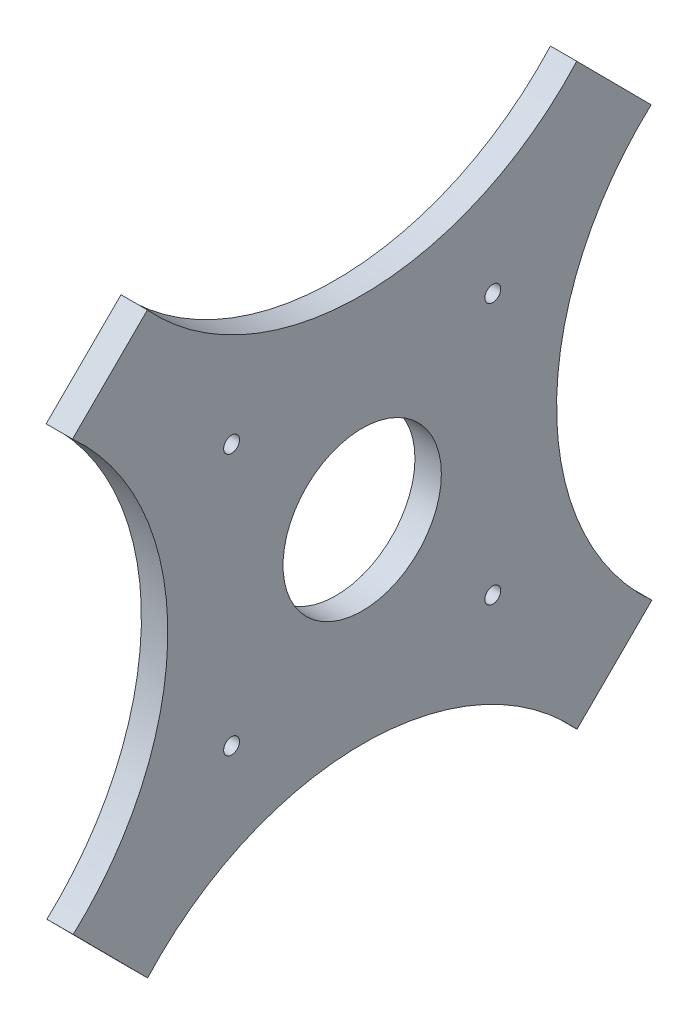
ISO-10303-21;
HEADER;
FILE_DESCRIPTION(('STEP AP214'),'2;1');
FILE_NAME('part.step','',(''),(''),'','','');
FILE_SCHEMA(('AUTOMOTIVE_DESIGN { 1 0 10303 214 1 1 1 1 }'));
ENDSEC;
DATA;
#1=APPLICATION_CONTEXT('core data for automotive mechanical design processes');
#2=APPLICATION_PROTOCOL_DEFINITION('international standard','automotive_design',2000,#1);
#3=PRODUCT_CONTEXT('',#1,'mechanical');
#4=PRODUCT('Part','Part','',(#3));
#5=PRODUCT_RELATED_PRODUCT_CATEGORY('part','',(#4));
#6=PRODUCT_DEFINITION_FORMATION('','',#4);
#7=PRODUCT_DEFINITION_CONTEXT('part definition',#1,'design');
#8=PRODUCT_DEFINITION('design','',#6,#7);
#9=PRODUCT_DEFINITION_SHAPE('','',#8);
#10=(LENGTH_UNIT() NAMED_UNIT(*) SI_UNIT(.MILLI.,.METRE.));
#11=(NAMED_UNIT(*) PLANE_ANGLE_UNIT() SI_UNIT($,.RADIAN.));
#12=(NAMED_UNIT(*) SI_UNIT($,.STERADIAN.) SOLID_ANGLE_UNIT());
#13=UNCERTAINTY_MEASURE_WITH_UNIT(LENGTH_MEASURE(1.E-05),#10,'distance_accuracy_value','');
#14=(GEOMETRIC_REPRESENTATION_CONTEXT(3) GLOBAL_UNCERTAINTY_ASSIGNED_CONTEXT((#13)) GLOBAL_UNIT_ASSIGNED_CONTEXT((#10,
#11,#12)) REPRESENTATION_CONTEXT('',''));
#15=CARTESIAN_POINT('',(0.,0.,0.));
#16=DIRECTION('',(0.,0.,1.));
#17=DIRECTION('',(1.,0.,0.));
#18=AXIS2_PLACEMENT_3D('',#15,#16,#17);
#19=CARTESIAN_POINT('',(5.,91.8371478475293,0.0795215444186728));
#20=DIRECTION('',(-1.,0.,0.));
#21=DIRECTION('',(0.,0.,1.));
#22=AXIS2_PLACEMENT_3D('',#19,#20,#21);
#23=PLANE('',#22);
#24=CARTESIAN_POINT('',(5.,91.8371478475293,0.0795215444186728));
#25=DIRECTION('',(-1.,0.,0.));
#26=DIRECTION('',(0.,0.,1.));
#27=AXIS2_PLACEMENT_3D('',#24,#25,#26);
#28=CIRCLE('',#27,55.0000000000001);
#29=CARTESIAN_POINT('',(5.,54.891168704609,-40.663510070459));
#30=VERTEX_POINT('',#29);
#31=CARTESIAN_POINT('',(5.,54.7561327206868,40.6996928533001));
#32=VERTEX_POINT('',#31);
#33=EDGE_CURVE('E150',#30,#32,#28,.T.);
#34=ORIENTED_EDGE('',*,*,#33,.T.);
#35=DIRECTION('',(0.,-0.704631132511389,0.709573792565451));
#36=VECTOR('',#35,1.);
#37=CARTESIAN_POINT('',(5.,40.6635100704589,54.8911687046093));
#38=LINE('',#37,#36);
#39=CARTESIAN_POINT('',(5.,40.6635100704589,54.8911687046093));
#40=VERTEX_POINT('',#39);
#41=EDGE_CURVE('E98',#32,#40,#38,.T.);
#42=ORIENTED_EDGE('',*,*,#41,.T.);
#43=CARTESIAN_POINT('',(5.,-0.0795215444186071,91.8371478475294));
#44=DIRECTION('',(-1.,0.,0.));
#45=DIRECTION('',(0.,0.,1.));
#46=AXIS2_PLACEMENT_3D('',#43,#44,#45);
#47=CIRCLE('',#46,55.);
#48=CARTESIAN_POINT('',(5.,-40.6996928533002,54.7561327206871));
#49=VERTEX_POINT('',#48);
#50=EDGE_CURVE('E165',#40,#49,#47,.T.);
#51=ORIENTED_EDGE('',*,*,#50,.T.);
#52=DIRECTION('',(0.,-0.70957379256545,-0.70463113251139));
#53=VECTOR('',#52,1.);
#54=CARTESIAN_POINT('',(5.,-40.6996928533002,54.7561327206871));
#55=LINE('',#54,#53);
#56=CARTESIAN_POINT('',(5.,-54.8911687046094,40.6635100704591));
#57=VERTEX_POINT('',#56);
#58=EDGE_CURVE('E178',#49,#57,#55,.T.);
#59=ORIENTED_EDGE('',*,*,#58,.T.);
#60=CARTESIAN_POINT('',(5.,-91.8371478475294,-0.079521544418527));
#61=DIRECTION('',(-1.,0.,0.));
#62=DIRECTION('',(0.,0.,1.));
#63=AXIS2_PLACEMENT_3D('',#60,#61,#62);
#64=CIRCLE('',#63,54.9999999999999);
#65=CARTESIAN_POINT('',(5.,-54.7561327206871,-40.6996928533001));
#66=VERTEX_POINT('',#65);
#67=EDGE_CURVE('E117',#57,#66,#64,.T.);
#68=ORIENTED_EDGE('',*,*,#67,.T.);
#69=DIRECTION('',(0.,0.704631132511389,-0.709573792565451));
#70=VECTOR('',#69,1.);
#71=CARTESIAN_POINT('',(5.,-40.6635100704593,-54.8911687046092));
#72=LINE('',#71,#70);
#73=CARTESIAN_POINT('',(5.,-40.6635100704593,-54.8911687046092));
#74=VERTEX_POINT('',#73);
#75=EDGE_CURVE('E111',#66,#74,#72,.T.);
#76=ORIENTED_EDGE('',*,*,#75,.T.);
#77=CARTESIAN_POINT('',(5.,0.0795215444185814,-91.8371478475293));
#78=DIRECTION('',(-1.,0.,0.));
#79=DIRECTION('',(0.,0.,1.));
#80=AXIS2_PLACEMENT_3D('',#77,#78,#79);
#81=CIRCLE('',#80,55.);
#82=CARTESIAN_POINT('',(5.,40.6996928533,-54.7561327206868));
#83=VERTEX_POINT('',#82);
#84=EDGE_CURVE('E115',#74,#83,#81,.T.);
#85=ORIENTED_EDGE('',*,*,#84,.T.);
#86=DIRECTION('',(0.,0.709573792565451,0.704631132511389));
#87=VECTOR('',#86,1.);
#88=CARTESIAN_POINT('',(5.,54.891168704609,-40.663510070459));
#89=LINE('',#88,#87);
#90=EDGE_CURVE('E55',#83,#30,#89,.T.);
#91=ORIENTED_EDGE('',*,*,#90,.T.);
#92=EDGE_LOOP('',(#34,#42,#51,#59,#68,#76,#85,#91));
#93=FACE_BOUND('',#92,.T.);
#94=CARTESIAN_POINT('',(5.,0.,0.));
#95=DIRECTION('',(1.,0.,0.));
#96=DIRECTION('',(0.,0.,-1.));
#97=AXIS2_PLACEMENT_3D('',#94,#95,#96);
#98=CIRCLE('',#97,15.);
#99=CARTESIAN_POINT('',(5.,0.,-15.));
#100=VERTEX_POINT('',#99);
#101=EDGE_CURVE('E139',#100,#100,#98,.T.);
#102=ORIENTED_EDGE('',*,*,#101,.F.);
#103=EDGE_LOOP('',(#102));
#104=FACE_BOUND('',#103,.T.);
#105=CARTESIAN_POINT('',(5.,24.7487373415292,-24.7487373415292));
#106=DIRECTION('',(1.,0.,0.));
#107=DIRECTION('',(0.,0.,-1.));
#108=AXIS2_PLACEMENT_3D('',#105,#106,#107);
#109=CIRCLE('',#108,1.5);
#110=CARTESIAN_POINT('',(5.,24.7487373415292,-26.2487373415292));
#111=VERTEX_POINT('',#110);
#112=EDGE_CURVE('E187',#111,#111,#109,.T.);
#113=ORIENTED_EDGE('',*,*,#112,.F.);
#114=EDGE_LOOP('',(#113));
#115=FACE_BOUND('',#114,.T.);
#116=CARTESIAN_POINT('',(5.,-24.7487373415292,-24.7487373415291));
#117=DIRECTION('',(1.,0.,0.));
#118=DIRECTION('',(0.,0.,-1.));
#119=AXIS2_PLACEMENT_3D('',#116,#117,#118);
#120=CIRCLE('',#119,1.5);
#121=CARTESIAN_POINT('',(5.,-24.7487373415292,-26.2487373415291));
#122=VERTEX_POINT('',#121);
#123=EDGE_CURVE('E193',#122,#122,#120,.T.);
#124=ORIENTED_EDGE('',*,*,#123,.F.);
#125=EDGE_LOOP('',(#124));
#126=FACE_BOUND('',#125,.T.);
#127=CARTESIAN_POINT('',(5.,-24.748737341529,24.7487373415293));
#128=DIRECTION('',(1.,0.,0.));
#129=DIRECTION('',(0.,0.,-1.));
#130=AXIS2_PLACEMENT_3D('',#127,#128,#129);
#131=CIRCLE('',#130,1.5);
#132=CARTESIAN_POINT('',(5.,-24.748737341529,23.2487373415293));
#133=VERTEX_POINT('',#132);
#134=EDGE_CURVE('E199',#133,#133,#131,.T.);
#135=ORIENTED_EDGE('',*,*,#134,.F.);
#136=EDGE_LOOP('',(#135));
#137=FACE_BOUND('',#136,.T.);
#138=CARTESIAN_POINT('',(5.,24.7487373415294,24.7487373415289));
#139=DIRECTION('',(1.,0.,0.));
#140=DIRECTION('',(0.,0.,-1.));
#141=AXIS2_PLACEMENT_3D('',#138,#139,#140);
#142=CIRCLE('',#141,1.5);
#143=CARTESIAN_POINT('',(5.,24.7487373415294,23.2487373415289));
#144=VERTEX_POINT('',#143);
#145=EDGE_CURVE('E205',#144,#144,#142,.T.);
#146=ORIENTED_EDGE('',*,*,#145,.F.);
#147=EDGE_LOOP('',(#146));
#148=FACE_BOUND('',#147,.T.);
#149=ADVANCED_FACE('F38',(#93,#104,#115,#126,#137,#148),#23,.F.);
#150=CARTESIAN_POINT('',(0.,91.8371478475293,0.0795215444186728));
#151=DIRECTION('',(-1.,0.,0.));
#152=DIRECTION('',(0.,0.,1.));
#153=AXIS2_PLACEMENT_3D('',#150,#151,#152);
#154=PLANE('',#153);
#155=CARTESIAN_POINT('',(0.,-24.748737341529,24.7487373415293));
#156=DIRECTION('',(1.,0.,0.));
#157=DIRECTION('',(0.,0.,-1.));
#158=AXIS2_PLACEMENT_3D('',#155,#156,#157);
#159=CIRCLE('',#158,1.5);
#160=CARTESIAN_POINT('',(0.,-24.748737341529,23.2487373415293));
#161=VERTEX_POINT('',#160);
#162=EDGE_CURVE('E202',#161,#161,#159,.T.);
#163=ORIENTED_EDGE('',*,*,#162,.T.);
#164=EDGE_LOOP('',(#163));
#165=FACE_BOUND('',#164,.T.);
#166=CARTESIAN_POINT('',(0.,24.7487373415292,-24.7487373415292));
#167=DIRECTION('',(1.,0.,0.));
#168=DIRECTION('',(0.,0.,-1.));
#169=AXIS2_PLACEMENT_3D('',#166,#167,#168);
#170=CIRCLE('',#169,1.5);
#171=CARTESIAN_POINT('',(0.,24.7487373415292,-26.2487373415292));
#172=VERTEX_POINT('',#171);
#173=EDGE_CURVE('E190',#172,#172,#170,.T.);
#174=ORIENTED_EDGE('',*,*,#173,.T.);
#175=EDGE_LOOP('',(#174));
#176=FACE_BOUND('',#175,.T.);
#177=CARTESIAN_POINT('',(0.,91.8371478475293,0.0795215444186728));
#178=DIRECTION('',(-1.,0.,0.));
#179=DIRECTION('',(0.,0.,1.));
#180=AXIS2_PLACEMENT_3D('',#177,#178,#179);
#181=CIRCLE('',#180,55.0000000000001);
#182=CARTESIAN_POINT('',(0.,54.891168704609,-40.663510070459));
#183=VERTEX_POINT('',#182);
#184=CARTESIAN_POINT('',(0.,54.7561327206868,40.6996928533001));
#185=VERTEX_POINT('',#184);
#186=EDGE_CURVE('E135',#183,#185,#181,.T.);
#187=ORIENTED_EDGE('',*,*,#186,.F.);
#188=DIRECTION('',(0.,0.709573792565451,0.704631132511389));
#189=VECTOR('',#188,1.);
#190=CARTESIAN_POINT('',(0.,54.891168704609,-40.663510070459));
#191=LINE('',#190,#189);
#192=CARTESIAN_POINT('',(0.,40.6996928533,-54.7561327206868));
#193=VERTEX_POINT('',#192);
#194=EDGE_CURVE('E90',#193,#183,#191,.T.);
#195=ORIENTED_EDGE('',*,*,#194,.F.);
#196=CARTESIAN_POINT('',(0.,0.0795215444185814,-91.8371478475293));
#197=DIRECTION('',(-1.,0.,0.));
#198=DIRECTION('',(0.,0.,1.));
#199=AXIS2_PLACEMENT_3D('',#196,#197,#198);
#200=CIRCLE('',#199,55.);
#201=CARTESIAN_POINT('',(0.,-40.6635100704593,-54.8911687046092));
#202=VERTEX_POINT('',#201);
#203=EDGE_CURVE('E84',#202,#193,#200,.T.);
#204=ORIENTED_EDGE('',*,*,#203,.F.);
#205=DIRECTION('',(0.,0.704631132511389,-0.709573792565451));
#206=VECTOR('',#205,1.);
#207=CARTESIAN_POINT('',(0.,-40.6635100704593,-54.8911687046092));
#208=LINE('',#207,#206);
#209=CARTESIAN_POINT('',(0.,-54.7561327206871,-40.6996928533001));
#210=VERTEX_POINT('',#209);
#211=EDGE_CURVE('E125',#210,#202,#208,.T.);
#212=ORIENTED_EDGE('',*,*,#211,.F.);
#213=CARTESIAN_POINT('',(0.,-91.8371478475294,-0.079521544418527));
#214=DIRECTION('',(-1.,0.,0.));
#215=DIRECTION('',(0.,0.,1.));
#216=AXIS2_PLACEMENT_3D('',#213,#214,#215);
#217=CIRCLE('',#216,54.9999999999999);
#218=CARTESIAN_POINT('',(0.,-54.8911687046094,40.6635100704591));
#219=VERTEX_POINT('',#218);
#220=EDGE_CURVE('E145',#219,#210,#217,.T.);
#221=ORIENTED_EDGE('',*,*,#220,.F.);
#222=DIRECTION('',(0.,-0.70957379256545,-0.70463113251139));
#223=VECTOR('',#222,1.);
#224=CARTESIAN_POINT('',(0.,-40.6996928533002,54.7561327206871));
#225=LINE('',#224,#223);
#226=CARTESIAN_POINT('',(0.,-40.6996928533002,54.7561327206871));
#227=VERTEX_POINT('',#226);
#228=EDGE_CURVE('E143',#227,#219,#225,.T.);
#229=ORIENTED_EDGE('',*,*,#228,.F.);
#230=CARTESIAN_POINT('',(0.,-0.0795215444186071,91.8371478475294));
#231=DIRECTION('',(-1.,0.,0.));
#232=DIRECTION('',(0.,0.,1.));
#233=AXIS2_PLACEMENT_3D('',#230,#231,#232);
#234=CIRCLE('',#233,55.);
#235=CARTESIAN_POINT('',(0.,40.6635100704589,54.8911687046093));
#236=VERTEX_POINT('',#235);
#237=EDGE_CURVE('E141',#236,#227,#234,.T.);
#238=ORIENTED_EDGE('',*,*,#237,.F.);
#239=DIRECTION('',(0.,-0.704631132511389,0.709573792565451));
#240=VECTOR('',#239,1.);
#241=CARTESIAN_POINT('',(0.,40.6635100704589,54.8911687046093));
#242=LINE('',#241,#240);
#243=EDGE_CURVE('E138',#185,#236,#242,.T.);
#244=ORIENTED_EDGE('',*,*,#243,.F.);
#245=EDGE_LOOP('',(#187,#195,#204,#212,#221,#229,#238,#244));
#246=FACE_BOUND('',#245,.T.);
#247=CARTESIAN_POINT('',(0.,0.,0.));
#248=DIRECTION('',(1.,0.,0.));
#249=DIRECTION('',(0.,0.,-1.));
#250=AXIS2_PLACEMENT_3D('',#247,#248,#249);
#251=CIRCLE('',#250,15.);
#252=CARTESIAN_POINT('',(0.,0.,-15.));
#253=VERTEX_POINT('',#252);
#254=EDGE_CURVE('E184',#253,#253,#251,.T.);
#255=ORIENTED_EDGE('',*,*,#254,.T.);
#256=EDGE_LOOP('',(#255));
#257=FACE_BOUND('',#256,.T.);
#258=CARTESIAN_POINT('',(0.,-24.7487373415292,-24.7487373415291));
#259=DIRECTION('',(1.,0.,0.));
#260=DIRECTION('',(0.,0.,-1.));
#261=AXIS2_PLACEMENT_3D('',#258,#259,#260);
#262=CIRCLE('',#261,1.5);
#263=CARTESIAN_POINT('',(0.,-24.7487373415292,-26.2487373415291));
#264=VERTEX_POINT('',#263);
#265=EDGE_CURVE('E196',#264,#264,#262,.T.);
#266=ORIENTED_EDGE('',*,*,#265,.T.);
#267=EDGE_LOOP('',(#266));
#268=FACE_BOUND('',#267,.T.);
#269=CARTESIAN_POINT('',(0.,24.7487373415294,24.7487373415289));
#270=DIRECTION('',(1.,0.,0.));
#271=DIRECTION('',(0.,0.,-1.));
#272=AXIS2_PLACEMENT_3D('',#269,#270,#271);
#273=CIRCLE('',#272,1.5);
#274=CARTESIAN_POINT('',(0.,24.7487373415294,23.2487373415289));
#275=VERTEX_POINT('',#274);
#276=EDGE_CURVE('E208',#275,#275,#273,.T.);
#277=ORIENTED_EDGE('',*,*,#276,.T.);
#278=EDGE_LOOP('',(#277));
#279=FACE_BOUND('',#278,.T.);
#280=ADVANCED_FACE('F169',(#165,#176,#246,#257,#268,#279),#154,.T.);
#281=CARTESIAN_POINT('',(5.,91.8371478475293,0.0795215444186728));
#282=DIRECTION('',(-1.,0.,0.));
#283=DIRECTION('',(0.,0.,1.));
#284=AXIS2_PLACEMENT_3D('',#281,#282,#283);
#285=CYLINDRICAL_SURFACE('',#284,55.0000000000001);
#286=ORIENTED_EDGE('',*,*,#186,.T.);
#287=DIRECTION('',(-1.,0.,0.));
#288=VECTOR('',#287,1.);
#289=CARTESIAN_POINT('',(5.,54.7561327206868,40.6996928533001));
#290=LINE('',#289,#288);
#291=EDGE_CURVE('E11',#32,#185,#290,.T.);
#292=ORIENTED_EDGE('',*,*,#291,.F.);
#293=ORIENTED_EDGE('',*,*,#33,.F.);
#294=DIRECTION('',(-1.,0.,0.));
#295=VECTOR('',#294,1.);
#296=CARTESIAN_POINT('',(5.,54.891168704609,-40.663510070459));
#297=LINE('',#296,#295);
#298=EDGE_CURVE('E131',#30,#183,#297,.T.);
#299=ORIENTED_EDGE('',*,*,#298,.T.);
#300=EDGE_LOOP('',(#286,#292,#293,#299));
#301=FACE_BOUND('',#300,.T.);
#302=ADVANCED_FACE('F40',(#301),#285,.F.);
#303=CARTESIAN_POINT('',(5.,40.6635100704589,54.8911687046093));
#304=DIRECTION('',(0.,-0.709573792565451,-0.704631132511389));
#305=DIRECTION('',(0.,0.704631132511389,-0.709573792565451));
#306=AXIS2_PLACEMENT_3D('',#303,#304,#305);
#307=PLANE('',#306);
#308=ORIENTED_EDGE('',*,*,#243,.T.);
#309=DIRECTION('',(-1.,0.,0.));
#310=VECTOR('',#309,1.);
#311=CARTESIAN_POINT('',(5.,40.6635100704589,54.8911687046093));
#312=LINE('',#311,#310);
#313=EDGE_CURVE('E47',#40,#236,#312,.T.);
#314=ORIENTED_EDGE('',*,*,#313,.F.);
#315=ORIENTED_EDGE('',*,*,#41,.F.);
#316=ORIENTED_EDGE('',*,*,#291,.T.);
#317=EDGE_LOOP('',(#308,#314,#315,#316));
#318=FACE_BOUND('',#317,.T.);
#319=ADVANCED_FACE('F240',(#318),#307,.F.);
#320=CARTESIAN_POINT('',(5.,-0.0795215444186071,91.8371478475294));
#321=DIRECTION('',(-1.,0.,0.));
#322=DIRECTION('',(0.,0.,1.));
#323=AXIS2_PLACEMENT_3D('',#320,#321,#322);
#324=CYLINDRICAL_SURFACE('',#323,55.);
#325=ORIENTED_EDGE('',*,*,#237,.T.);
#326=DIRECTION('',(-1.,0.,0.));
#327=VECTOR('',#326,1.);
#328=CARTESIAN_POINT('',(5.,-40.6996928533002,54.7561327206871));
#329=LINE('',#328,#327);
#330=EDGE_CURVE('E157',#49,#227,#329,.T.);
#331=ORIENTED_EDGE('',*,*,#330,.F.);
#332=ORIENTED_EDGE('',*,*,#50,.F.);
#333=ORIENTED_EDGE('',*,*,#313,.T.);
#334=EDGE_LOOP('',(#325,#331,#332,#333));
#335=FACE_BOUND('',#334,.T.);
#336=ADVANCED_FACE('F163',(#335),#324,.F.);
#337=CARTESIAN_POINT('',(5.,-40.6996928533002,54.7561327206871));
#338=DIRECTION('',(0.,0.70463113251139,-0.70957379256545));
#339=DIRECTION('',(0.,0.70957379256545,0.70463113251139));
#340=AXIS2_PLACEMENT_3D('',#337,#338,#339);
#341=PLANE('',#340);
#342=ORIENTED_EDGE('',*,*,#228,.T.);
#343=DIRECTION('',(-1.,0.,0.));
#344=VECTOR('',#343,1.);
#345=CARTESIAN_POINT('',(5.,-54.8911687046094,40.6635100704591));
#346=LINE('',#345,#344);
#347=EDGE_CURVE('E154',#57,#219,#346,.T.);
#348=ORIENTED_EDGE('',*,*,#347,.F.);
#349=ORIENTED_EDGE('',*,*,#58,.F.);
#350=ORIENTED_EDGE('',*,*,#330,.T.);
#351=EDGE_LOOP('',(#342,#348,#349,#350));
#352=FACE_BOUND('',#351,.T.);
#353=ADVANCED_FACE('F174',(#352),#341,.F.);
#354=CARTESIAN_POINT('',(5.,-91.8371478475294,-0.079521544418527));
#355=DIRECTION('',(-1.,0.,0.));
#356=DIRECTION('',(0.,0.,1.));
#357=AXIS2_PLACEMENT_3D('',#354,#355,#356);
#358=CYLINDRICAL_SURFACE('',#357,54.9999999999999);
#359=ORIENTED_EDGE('',*,*,#220,.T.);
#360=DIRECTION('',(-1.,0.,0.));
#361=VECTOR('',#360,1.);
#362=CARTESIAN_POINT('',(5.,-54.7561327206871,-40.6996928533001));
#363=LINE('',#362,#361);
#364=EDGE_CURVE('E126',#66,#210,#363,.T.);
#365=ORIENTED_EDGE('',*,*,#364,.F.);
#366=ORIENTED_EDGE('',*,*,#67,.F.);
#367=ORIENTED_EDGE('',*,*,#347,.T.);
#368=EDGE_LOOP('',(#359,#365,#366,#367));
#369=FACE_BOUND('',#368,.T.);
#370=ADVANCED_FACE('F177',(#369),#358,.F.);
#371=CARTESIAN_POINT('',(5.,-40.6635100704593,-54.8911687046092));
#372=DIRECTION('',(0.,0.709573792565451,0.704631132511389));
#373=DIRECTION('',(0.,-0.704631132511389,0.709573792565451));
#374=AXIS2_PLACEMENT_3D('',#371,#372,#373);
#375=PLANE('',#374);
#376=ORIENTED_EDGE('',*,*,#211,.T.);
#377=DIRECTION('',(-1.,0.,0.));
#378=VECTOR('',#377,1.);
#379=CARTESIAN_POINT('',(5.,-40.6635100704593,-54.8911687046092));
#380=LINE('',#379,#378);
#381=EDGE_CURVE('E122',#74,#202,#380,.T.);
#382=ORIENTED_EDGE('',*,*,#381,.F.);
#383=ORIENTED_EDGE('',*,*,#75,.F.);
#384=ORIENTED_EDGE('',*,*,#364,.T.);
#385=EDGE_LOOP('',(#376,#382,#383,#384));
#386=FACE_BOUND('',#385,.T.);
#387=ADVANCED_FACE('F123',(#386),#375,.F.);
#388=CARTESIAN_POINT('',(5.,0.0795215444185814,-91.8371478475293));
#389=DIRECTION('',(-1.,0.,0.));
#390=DIRECTION('',(0.,0.,1.));
#391=AXIS2_PLACEMENT_3D('',#388,#389,#390);
#392=CYLINDRICAL_SURFACE('',#391,55.);
#393=ORIENTED_EDGE('',*,*,#203,.T.);
#394=DIRECTION('',(-1.,0.,0.));
#395=VECTOR('',#394,1.);
#396=CARTESIAN_POINT('',(5.,40.6996928533,-54.7561327206868));
#397=LINE('',#396,#395);
#398=EDGE_CURVE('E127',#83,#193,#397,.T.);
#399=ORIENTED_EDGE('',*,*,#398,.F.);
#400=ORIENTED_EDGE('',*,*,#84,.F.);
#401=ORIENTED_EDGE('',*,*,#381,.T.);
#402=EDGE_LOOP('',(#393,#399,#400,#401));
#403=FACE_BOUND('',#402,.T.);
#404=ADVANCED_FACE('F129',(#403),#392,.F.);
#405=CARTESIAN_POINT('',(5.,54.891168704609,-40.663510070459));
#406=DIRECTION('',(0.,-0.704631132511389,0.709573792565451));
#407=DIRECTION('',(0.,-0.709573792565451,-0.704631132511389));
#408=AXIS2_PLACEMENT_3D('',#405,#406,#407);
#409=PLANE('',#408);
#410=ORIENTED_EDGE('',*,*,#194,.T.);
#411=ORIENTED_EDGE('',*,*,#298,.F.);
#412=ORIENTED_EDGE('',*,*,#90,.F.);
#413=ORIENTED_EDGE('',*,*,#398,.T.);
#414=EDGE_LOOP('',(#410,#411,#412,#413));
#415=FACE_BOUND('',#414,.T.);
#416=ADVANCED_FACE('F228',(#415),#409,.F.);
#417=CARTESIAN_POINT('',(5.,0.,0.));
#418=DIRECTION('',(-1.,0.,0.));
#419=DIRECTION('',(0.,0.,1.));
#420=AXIS2_PLACEMENT_3D('',#417,#418,#419);
#421=CYLINDRICAL_SURFACE('',#420,15.);
#422=ORIENTED_EDGE('',*,*,#101,.T.);
#423=EDGE_LOOP('',(#422));
#424=FACE_BOUND('',#423,.T.);
#425=ORIENTED_EDGE('',*,*,#254,.F.);
#426=EDGE_LOOP('',(#425));
#427=FACE_BOUND('',#426,.T.);
#428=ADVANCED_FACE('F225',(#424,#427),#421,.F.);
#429=CARTESIAN_POINT('',(5.,24.7487373415292,-24.7487373415292));
#430=DIRECTION('',(-1.,0.,0.));
#431=DIRECTION('',(0.,0.,1.));
#432=AXIS2_PLACEMENT_3D('',#429,#430,#431);
#433=CYLINDRICAL_SURFACE('',#432,1.5);
#434=ORIENTED_EDGE('',*,*,#112,.T.);
#435=EDGE_LOOP('',(#434));
#436=FACE_BOUND('',#435,.T.);
#437=ORIENTED_EDGE('',*,*,#173,.F.);
#438=EDGE_LOOP('',(#437));
#439=FACE_BOUND('',#438,.T.);
#440=ADVANCED_FACE('F304',(#436,#439),#433,.F.);
#441=CARTESIAN_POINT('',(5.,-24.7487373415292,-24.7487373415291));
#442=DIRECTION('',(-1.,0.,0.));
#443=DIRECTION('',(0.,0.,1.));
#444=AXIS2_PLACEMENT_3D('',#441,#442,#443);
#445=CYLINDRICAL_SURFACE('',#444,1.5);
#446=ORIENTED_EDGE('',*,*,#123,.T.);
#447=EDGE_LOOP('',(#446));
#448=FACE_BOUND('',#447,.T.);
#449=ORIENTED_EDGE('',*,*,#265,.F.);
#450=EDGE_LOOP('',(#449));
#451=FACE_BOUND('',#450,.T.);
#452=ADVANCED_FACE('F312',(#448,#451),#445,.F.);
#453=CARTESIAN_POINT('',(5.,-24.748737341529,24.7487373415293));
#454=DIRECTION('',(-1.,0.,0.));
#455=DIRECTION('',(0.,0.,1.));
#456=AXIS2_PLACEMENT_3D('',#453,#454,#455);
#457=CYLINDRICAL_SURFACE('',#456,1.5);
#458=ORIENTED_EDGE('',*,*,#134,.T.);
#459=EDGE_LOOP('',(#458));
#460=FACE_BOUND('',#459,.T.);
#461=ORIENTED_EDGE('',*,*,#162,.F.);
#462=EDGE_LOOP('',(#461));
#463=FACE_BOUND('',#462,.T.);
#464=ADVANCED_FACE('F320',(#460,#463),#457,.F.);
#465=CARTESIAN_POINT('',(5.,24.7487373415294,24.7487373415289));
#466=DIRECTION('',(-1.,0.,0.));
#467=DIRECTION('',(0.,0.,1.));
#468=AXIS2_PLACEMENT_3D('',#465,#466,#467);
#469=CYLINDRICAL_SURFACE('',#468,1.5);
#470=ORIENTED_EDGE('',*,*,#145,.T.);
#471=EDGE_LOOP('',(#470));
#472=FACE_BOUND('',#471,.T.);
#473=ORIENTED_EDGE('',*,*,#276,.F.);
#474=EDGE_LOOP('',(#473));
#475=FACE_BOUND('',#474,.T.);
#476=ADVANCED_FACE('F214',(#472,#475),#469,.F.);
#477=CLOSED_SHELL('',(#149,#280,#302,#319,#336,#353,#370,#387,#404,#416,#428,#440,#452,#464,#476));
#478=MANIFOLD_SOLID_BREP('B2',#477);
#479=ADVANCED_BREP_SHAPE_REPRESENTATION('',(#18,#478),#14);
#480=SHAPE_DEFINITION_REPRESENTATION(#9,#479);
ENDSEC;
END-ISO-10303-21;
